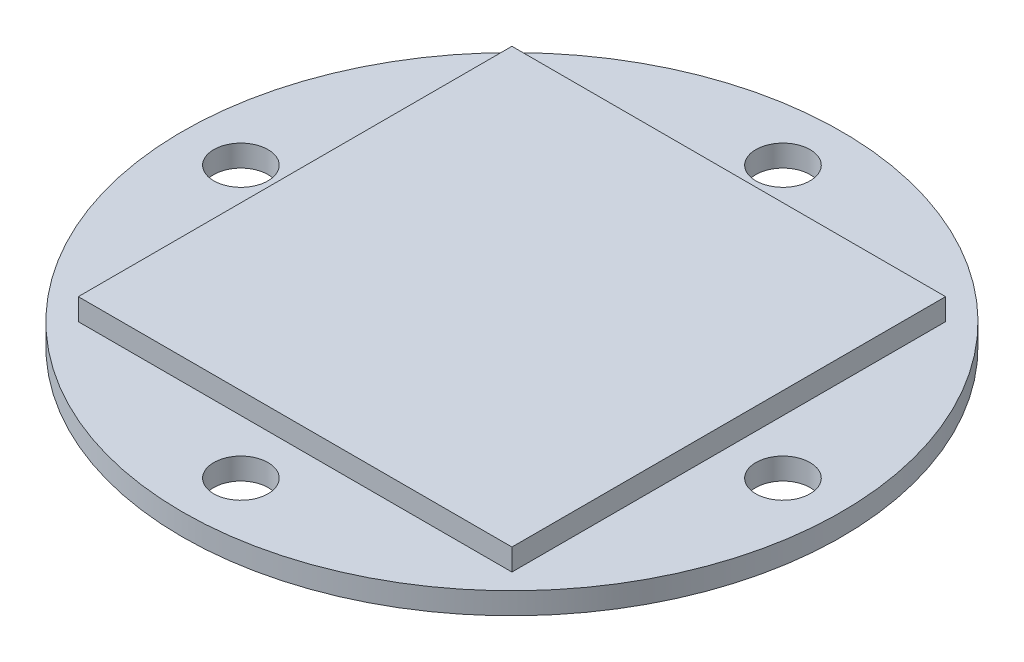
ISO-10303-21;
HEADER;
FILE_DESCRIPTION(('STEP AP214'),'2;1');
FILE_NAME('part.step','',(''),(''),'','','');
FILE_SCHEMA(('AUTOMOTIVE_DESIGN { 1 0 10303 214 1 1 1 1 }'));
ENDSEC;
DATA;
#1=APPLICATION_CONTEXT('core data for automotive mechanical design processes');
#2=APPLICATION_PROTOCOL_DEFINITION('international standard','automotive_design',2000,#1);
#3=PRODUCT_CONTEXT('',#1,'mechanical');
#4=PRODUCT('Part','Part','',(#3));
#5=PRODUCT_RELATED_PRODUCT_CATEGORY('part','',(#4));
#6=PRODUCT_DEFINITION_FORMATION('','',#4);
#7=PRODUCT_DEFINITION_CONTEXT('part definition',#1,'design');
#8=PRODUCT_DEFINITION('design','',#6,#7);
#9=PRODUCT_DEFINITION_SHAPE('','',#8);
#10=(LENGTH_UNIT() NAMED_UNIT(*) SI_UNIT(.MILLI.,.METRE.));
#11=(NAMED_UNIT(*) PLANE_ANGLE_UNIT() SI_UNIT($,.RADIAN.));
#12=(NAMED_UNIT(*) SI_UNIT($,.STERADIAN.) SOLID_ANGLE_UNIT());
#13=UNCERTAINTY_MEASURE_WITH_UNIT(LENGTH_MEASURE(1.E-05),#10,'distance_accuracy_value','');
#14=(GEOMETRIC_REPRESENTATION_CONTEXT(3) GLOBAL_UNCERTAINTY_ASSIGNED_CONTEXT((#13)) GLOBAL_UNIT_ASSIGNED_CONTEXT((#10,
#11,#12)) REPRESENTATION_CONTEXT('',''));
#15=CARTESIAN_POINT('',(0.,0.,0.));
#16=DIRECTION('',(0.,0.,1.));
#17=DIRECTION('',(1.,0.,0.));
#18=AXIS2_PLACEMENT_3D('',#15,#16,#17);
#19=CARTESIAN_POINT('',(0.,0.,0.));
#20=DIRECTION('',(0.,1.,0.));
#21=DIRECTION('',(0.,0.,1.));
#22=AXIS2_PLACEMENT_3D('',#19,#20,#21);
#23=PLANE('',#22);
#24=DIRECTION('',(1.,0.,0.));
#25=VECTOR('',#24,1.);
#26=CARTESIAN_POINT('',(0.,0.,20.));
#27=LINE('',#26,#25);
#28=CARTESIAN_POINT('',(7.5,0.,20.));
#29=VERTEX_POINT('',#28);
#30=CARTESIAN_POINT('',(22.5,0.,20.));
#31=VERTEX_POINT('',#30);
#32=EDGE_CURVE('E163',#29,#31,#27,.T.);
#33=ORIENTED_EDGE('',*,*,#32,.T.);
#34=DIRECTION('',(0.,0.,-1.));
#35=VECTOR('',#34,1.);
#36=CARTESIAN_POINT('',(22.5,0.,0.));
#37=LINE('',#36,#35);
#38=CARTESIAN_POINT('',(22.5,0.,-20.));
#39=VERTEX_POINT('',#38);
#40=EDGE_CURVE('E145',#31,#39,#37,.T.);
#41=ORIENTED_EDGE('',*,*,#40,.T.);
#42=DIRECTION('',(1.,0.,0.));
#43=VECTOR('',#42,1.);
#44=CARTESIAN_POINT('',(0.,0.,-20.));
#45=LINE('',#44,#43);
#46=CARTESIAN_POINT('',(7.5,0.,-20.));
#47=VERTEX_POINT('',#46);
#48=EDGE_CURVE('E154',#47,#39,#45,.T.);
#49=ORIENTED_EDGE('',*,*,#48,.F.);
#50=DIRECTION('',(0.,0.,1.));
#51=VECTOR('',#50,1.);
#52=CARTESIAN_POINT('',(7.5,0.,0.));
#53=LINE('',#52,#51);
#54=EDGE_CURVE('E170',#47,#29,#53,.T.);
#55=ORIENTED_EDGE('',*,*,#54,.T.);
#56=EDGE_LOOP('',(#33,#41,#49,#55));
#57=FACE_BOUND('',#56,.T.);
#58=CARTESIAN_POINT('',(0.,0.,0.));
#59=DIRECTION('',(0.,1.,0.));
#60=DIRECTION('',(0.,0.,1.));
#61=AXIS2_PLACEMENT_3D('',#58,#59,#60);
#62=CIRCLE('',#61,76.);
#63=CARTESIAN_POINT('',(0.,0.,76.));
#64=VERTEX_POINT('',#63);
#65=EDGE_CURVE('E260',#64,#64,#62,.T.);
#66=ORIENTED_EDGE('',*,*,#65,.F.);
#67=EDGE_LOOP('',(#66));
#68=FACE_BOUND('',#67,.T.);
#69=CARTESIAN_POINT('',(0.,0.,62.5));
#70=DIRECTION('',(0.,1.,0.));
#71=DIRECTION('',(0.,0.,1.));
#72=AXIS2_PLACEMENT_3D('',#69,#70,#71);
#73=CIRCLE('',#72,6.25);
#74=CARTESIAN_POINT('',(0.,0.,68.75));
#75=VERTEX_POINT('',#74);
#76=EDGE_CURVE('E281',#75,#75,#73,.T.);
#77=ORIENTED_EDGE('',*,*,#76,.T.);
#78=EDGE_LOOP('',(#77));
#79=FACE_BOUND('',#78,.T.);
#80=CARTESIAN_POINT('',(62.5,0.,0.));
#81=DIRECTION('',(0.,1.,0.));
#82=DIRECTION('',(0.,0.,1.));
#83=AXIS2_PLACEMENT_3D('',#80,#81,#82);
#84=CIRCLE('',#83,6.25);
#85=CARTESIAN_POINT('',(62.5,0.,6.25));
#86=VERTEX_POINT('',#85);
#87=EDGE_CURVE('E273',#86,#86,#84,.T.);
#88=ORIENTED_EDGE('',*,*,#87,.T.);
#89=EDGE_LOOP('',(#88));
#90=FACE_BOUND('',#89,.T.);
#91=CARTESIAN_POINT('',(0.,0.,-62.5));
#92=DIRECTION('',(0.,1.,0.));
#93=DIRECTION('',(0.,0.,1.));
#94=AXIS2_PLACEMENT_3D('',#91,#92,#93);
#95=CIRCLE('',#94,6.25);
#96=CARTESIAN_POINT('',(0.,0.,-56.25));
#97=VERTEX_POINT('',#96);
#98=EDGE_CURVE('E265',#97,#97,#95,.T.);
#99=ORIENTED_EDGE('',*,*,#98,.T.);
#100=EDGE_LOOP('',(#99));
#101=FACE_BOUND('',#100,.T.);
#102=CARTESIAN_POINT('',(-62.5,0.,0.));
#103=DIRECTION('',(0.,1.,0.));
#104=DIRECTION('',(0.,0.,1.));
#105=AXIS2_PLACEMENT_3D('',#102,#103,#104);
#106=CIRCLE('',#105,6.25);
#107=CARTESIAN_POINT('',(-62.5,0.,6.25));
#108=VERTEX_POINT('',#107);
#109=EDGE_CURVE('E261',#108,#108,#106,.T.);
#110=ORIENTED_EDGE('',*,*,#109,.T.);
#111=EDGE_LOOP('',(#110));
#112=FACE_BOUND('',#111,.T.);
#113=DIRECTION('',(-1.,0.,0.));
#114=VECTOR('',#113,1.);
#115=CARTESIAN_POINT('',(0.,0.,20.));
#116=LINE('',#115,#114);
#117=CARTESIAN_POINT('',(-7.5,0.,20.));
#118=VERTEX_POINT('',#117);
#119=CARTESIAN_POINT('',(-22.5,0.,20.));
#120=VERTEX_POINT('',#119);
#121=EDGE_CURVE('E184',#118,#120,#116,.T.);
#122=ORIENTED_EDGE('',*,*,#121,.F.);
#123=DIRECTION('',(0.,0.,1.));
#124=VECTOR('',#123,1.);
#125=CARTESIAN_POINT('',(-7.5,0.,0.));
#126=LINE('',#125,#124);
#127=CARTESIAN_POINT('',(-7.5,0.,-20.));
#128=VERTEX_POINT('',#127);
#129=EDGE_CURVE('E196',#128,#118,#126,.T.);
#130=ORIENTED_EDGE('',*,*,#129,.F.);
#131=DIRECTION('',(-1.,0.,0.));
#132=VECTOR('',#131,1.);
#133=CARTESIAN_POINT('',(0.,0.,-20.));
#134=LINE('',#133,#132);
#135=CARTESIAN_POINT('',(-22.5,0.,-20.));
#136=VERTEX_POINT('',#135);
#137=EDGE_CURVE('E192',#128,#136,#134,.T.);
#138=ORIENTED_EDGE('',*,*,#137,.T.);
#139=DIRECTION('',(0.,0.,-1.));
#140=VECTOR('',#139,1.);
#141=CARTESIAN_POINT('',(-22.5,0.,0.));
#142=LINE('',#141,#140);
#143=EDGE_CURVE('E188',#120,#136,#142,.T.);
#144=ORIENTED_EDGE('',*,*,#143,.F.);
#145=EDGE_LOOP('',(#122,#130,#138,#144));
#146=FACE_BOUND('',#145,.T.);
#147=ADVANCED_FACE('F41',(#57,#68,#79,#90,#101,#112,#146),#23,.F.);
#148=CARTESIAN_POINT('',(0.,5.,0.));
#149=DIRECTION('',(0.,1.,0.));
#150=DIRECTION('',(0.,0.,1.));
#151=AXIS2_PLACEMENT_3D('',#148,#149,#150);
#152=PLANE('',#151);
#153=CARTESIAN_POINT('',(-62.5,5.,0.));
#154=DIRECTION('',(0.,1.,0.));
#155=DIRECTION('',(0.,0.,1.));
#156=AXIS2_PLACEMENT_3D('',#153,#154,#155);
#157=CIRCLE('',#156,6.25);
#158=CARTESIAN_POINT('',(-62.5,5.,6.25));
#159=VERTEX_POINT('',#158);
#160=EDGE_CURVE('E256',#159,#159,#157,.T.);
#161=ORIENTED_EDGE('',*,*,#160,.F.);
#162=EDGE_LOOP('',(#161));
#163=FACE_BOUND('',#162,.T.);
#164=CARTESIAN_POINT('',(0.,5.,-62.5));
#165=DIRECTION('',(0.,1.,0.));
#166=DIRECTION('',(0.,0.,1.));
#167=AXIS2_PLACEMENT_3D('',#164,#165,#166);
#168=CIRCLE('',#167,6.25);
#169=CARTESIAN_POINT('',(0.,5.,-56.25));
#170=VERTEX_POINT('',#169);
#171=EDGE_CURVE('E269',#170,#170,#168,.T.);
#172=ORIENTED_EDGE('',*,*,#171,.F.);
#173=EDGE_LOOP('',(#172));
#174=FACE_BOUND('',#173,.T.);
#175=CARTESIAN_POINT('',(62.5,5.,0.));
#176=DIRECTION('',(0.,1.,0.));
#177=DIRECTION('',(0.,0.,1.));
#178=AXIS2_PLACEMENT_3D('',#175,#176,#177);
#179=CIRCLE('',#178,6.25);
#180=CARTESIAN_POINT('',(62.5,5.,6.25));
#181=VERTEX_POINT('',#180);
#182=EDGE_CURVE('E277',#181,#181,#179,.T.);
#183=ORIENTED_EDGE('',*,*,#182,.F.);
#184=EDGE_LOOP('',(#183));
#185=FACE_BOUND('',#184,.T.);
#186=CARTESIAN_POINT('',(0.,5.,62.5));
#187=DIRECTION('',(0.,1.,0.));
#188=DIRECTION('',(0.,0.,1.));
#189=AXIS2_PLACEMENT_3D('',#186,#187,#188);
#190=CIRCLE('',#189,6.25);
#191=CARTESIAN_POINT('',(0.,5.,68.75));
#192=VERTEX_POINT('',#191);
#193=EDGE_CURVE('E255',#192,#192,#190,.T.);
#194=ORIENTED_EDGE('',*,*,#193,.F.);
#195=EDGE_LOOP('',(#194));
#196=FACE_BOUND('',#195,.T.);
#197=CARTESIAN_POINT('',(0.,5.,0.));
#198=DIRECTION('',(0.,1.,0.));
#199=DIRECTION('',(0.,0.,1.));
#200=AXIS2_PLACEMENT_3D('',#197,#198,#199);
#201=CIRCLE('',#200,76.);
#202=CARTESIAN_POINT('',(0.,5.,76.));
#203=VERTEX_POINT('',#202);
#204=EDGE_CURVE('E288',#203,#203,#201,.T.);
#205=ORIENTED_EDGE('',*,*,#204,.T.);
#206=EDGE_LOOP('',(#205));
#207=FACE_BOUND('',#206,.T.);
#208=DIRECTION('',(0.,0.,1.));
#209=VECTOR('',#208,1.);
#210=CARTESIAN_POINT('',(50.,5.,-50.));
#211=LINE('',#210,#209);
#212=CARTESIAN_POINT('',(50.,5.,-50.));
#213=VERTEX_POINT('',#212);
#214=CARTESIAN_POINT('',(50.,5.,50.));
#215=VERTEX_POINT('',#214);
#216=EDGE_CURVE('E232',#213,#215,#211,.T.);
#217=ORIENTED_EDGE('',*,*,#216,.T.);
#218=DIRECTION('',(1.,0.,0.));
#219=VECTOR('',#218,1.);
#220=CARTESIAN_POINT('',(-50.,5.,50.));
#221=LINE('',#220,#219);
#222=CARTESIAN_POINT('',(-50.,5.,50.));
#223=VERTEX_POINT('',#222);
#224=EDGE_CURVE('E212',#223,#215,#221,.T.);
#225=ORIENTED_EDGE('',*,*,#224,.F.);
#226=DIRECTION('',(0.,0.,1.));
#227=VECTOR('',#226,1.);
#228=CARTESIAN_POINT('',(-50.,5.,-50.));
#229=LINE('',#228,#227);
#230=CARTESIAN_POINT('',(-50.,5.,-50.));
#231=VERTEX_POINT('',#230);
#232=EDGE_CURVE('E217',#231,#223,#229,.T.);
#233=ORIENTED_EDGE('',*,*,#232,.F.);
#234=DIRECTION('',(1.,0.,0.));
#235=VECTOR('',#234,1.);
#236=CARTESIAN_POINT('',(-50.,5.,-50.));
#237=LINE('',#236,#235);
#238=EDGE_CURVE('E236',#231,#213,#237,.T.);
#239=ORIENTED_EDGE('',*,*,#238,.T.);
#240=EDGE_LOOP('',(#217,#225,#233,#239));
#241=FACE_BOUND('',#240,.T.);
#242=ADVANCED_FACE('F383',(#163,#174,#185,#196,#207,#241),#152,.T.);
#243=CARTESIAN_POINT('',(0.,5.,0.));
#244=DIRECTION('',(0.,-1.,0.));
#245=DIRECTION('',(0.,0.,-1.));
#246=AXIS2_PLACEMENT_3D('',#243,#244,#245);
#247=CYLINDRICAL_SURFACE('',#246,76.);
#248=ORIENTED_EDGE('',*,*,#204,.F.);
#249=EDGE_LOOP('',(#248));
#250=FACE_BOUND('',#249,.T.);
#251=ORIENTED_EDGE('',*,*,#65,.T.);
#252=EDGE_LOOP('',(#251));
#253=FACE_BOUND('',#252,.T.);
#254=ADVANCED_FACE('F388',(#250,#253),#247,.T.);
#255=CARTESIAN_POINT('',(0.,5.,62.5));
#256=DIRECTION('',(0.,-1.,0.));
#257=DIRECTION('',(0.,0.,-1.));
#258=AXIS2_PLACEMENT_3D('',#255,#256,#257);
#259=CYLINDRICAL_SURFACE('',#258,6.25);
#260=ORIENTED_EDGE('',*,*,#193,.T.);
#261=EDGE_LOOP('',(#260));
#262=FACE_BOUND('',#261,.T.);
#263=ORIENTED_EDGE('',*,*,#76,.F.);
#264=EDGE_LOOP('',(#263));
#265=FACE_BOUND('',#264,.T.);
#266=ADVANCED_FACE('F393',(#262,#265),#259,.F.);
#267=CARTESIAN_POINT('',(62.5,5.,0.));
#268=DIRECTION('',(0.,-1.,0.));
#269=DIRECTION('',(0.,0.,-1.));
#270=AXIS2_PLACEMENT_3D('',#267,#268,#269);
#271=CYLINDRICAL_SURFACE('',#270,6.25);
#272=ORIENTED_EDGE('',*,*,#182,.T.);
#273=EDGE_LOOP('',(#272));
#274=FACE_BOUND('',#273,.T.);
#275=ORIENTED_EDGE('',*,*,#87,.F.);
#276=EDGE_LOOP('',(#275));
#277=FACE_BOUND('',#276,.T.);
#278=ADVANCED_FACE('F398',(#274,#277),#271,.F.);
#279=CARTESIAN_POINT('',(0.,5.,-62.5));
#280=DIRECTION('',(0.,-1.,0.));
#281=DIRECTION('',(0.,0.,-1.));
#282=AXIS2_PLACEMENT_3D('',#279,#280,#281);
#283=CYLINDRICAL_SURFACE('',#282,6.25);
#284=ORIENTED_EDGE('',*,*,#171,.T.);
#285=EDGE_LOOP('',(#284));
#286=FACE_BOUND('',#285,.T.);
#287=ORIENTED_EDGE('',*,*,#98,.F.);
#288=EDGE_LOOP('',(#287));
#289=FACE_BOUND('',#288,.T.);
#290=ADVANCED_FACE('F478',(#286,#289),#283,.F.);
#291=CARTESIAN_POINT('',(-62.5,5.,0.));
#292=DIRECTION('',(0.,-1.,0.));
#293=DIRECTION('',(0.,0.,-1.));
#294=AXIS2_PLACEMENT_3D('',#291,#292,#293);
#295=CYLINDRICAL_SURFACE('',#294,6.25);
#296=ORIENTED_EDGE('',*,*,#160,.T.);
#297=EDGE_LOOP('',(#296));
#298=FACE_BOUND('',#297,.T.);
#299=ORIENTED_EDGE('',*,*,#109,.F.);
#300=EDGE_LOOP('',(#299));
#301=FACE_BOUND('',#300,.T.);
#302=ADVANCED_FACE('F474',(#298,#301),#295,.F.);
#303=CARTESIAN_POINT('',(-50.,10.,50.));
#304=DIRECTION('',(0.,0.,-1.));
#305=DIRECTION('',(-1.,0.,0.));
#306=AXIS2_PLACEMENT_3D('',#303,#304,#305);
#307=PLANE('',#306);
#308=ORIENTED_EDGE('',*,*,#224,.T.);
#309=DIRECTION('',(0.,-1.,0.));
#310=VECTOR('',#309,1.);
#311=CARTESIAN_POINT('',(50.,10.,50.));
#312=LINE('',#311,#310);
#313=CARTESIAN_POINT('',(50.,10.,50.));
#314=VERTEX_POINT('',#313);
#315=EDGE_CURVE('E252',#314,#215,#312,.T.);
#316=ORIENTED_EDGE('',*,*,#315,.F.);
#317=DIRECTION('',(1.,0.,0.));
#318=VECTOR('',#317,1.);
#319=CARTESIAN_POINT('',(-50.,10.,50.));
#320=LINE('',#319,#318);
#321=CARTESIAN_POINT('',(-50.,10.,50.));
#322=VERTEX_POINT('',#321);
#323=EDGE_CURVE('E213',#322,#314,#320,.T.);
#324=ORIENTED_EDGE('',*,*,#323,.F.);
#325=DIRECTION('',(0.,-1.,0.));
#326=VECTOR('',#325,1.);
#327=CARTESIAN_POINT('',(-50.,10.,50.));
#328=LINE('',#327,#326);
#329=EDGE_CURVE('E228',#322,#223,#328,.T.);
#330=ORIENTED_EDGE('',*,*,#329,.T.);
#331=EDGE_LOOP('',(#308,#316,#324,#330));
#332=FACE_BOUND('',#331,.T.);
#333=ADVANCED_FACE('F470',(#332),#307,.F.);
#334=CARTESIAN_POINT('',(50.,10.,-50.));
#335=DIRECTION('',(1.,0.,0.));
#336=DIRECTION('',(0.,0.,-1.));
#337=AXIS2_PLACEMENT_3D('',#334,#335,#336);
#338=PLANE('',#337);
#339=ORIENTED_EDGE('',*,*,#216,.F.);
#340=DIRECTION('',(0.,-1.,0.));
#341=VECTOR('',#340,1.);
#342=CARTESIAN_POINT('',(50.,10.,-50.));
#343=LINE('',#342,#341);
#344=CARTESIAN_POINT('',(50.,10.,-50.));
#345=VERTEX_POINT('',#344);
#346=EDGE_CURVE('E249',#345,#213,#343,.T.);
#347=ORIENTED_EDGE('',*,*,#346,.F.);
#348=DIRECTION('',(0.,0.,1.));
#349=VECTOR('',#348,1.);
#350=CARTESIAN_POINT('',(50.,10.,-50.));
#351=LINE('',#350,#349);
#352=EDGE_CURVE('E216',#345,#314,#351,.T.);
#353=ORIENTED_EDGE('',*,*,#352,.T.);
#354=ORIENTED_EDGE('',*,*,#315,.T.);
#355=EDGE_LOOP('',(#339,#347,#353,#354));
#356=FACE_BOUND('',#355,.T.);
#357=ADVANCED_FACE('F466',(#356),#338,.T.);
#358=CARTESIAN_POINT('',(-50.,10.,-50.));
#359=DIRECTION('',(0.,0.,-1.));
#360=DIRECTION('',(-1.,0.,0.));
#361=AXIS2_PLACEMENT_3D('',#358,#359,#360);
#362=PLANE('',#361);
#363=ORIENTED_EDGE('',*,*,#238,.F.);
#364=DIRECTION('',(0.,-1.,0.));
#365=VECTOR('',#364,1.);
#366=CARTESIAN_POINT('',(-50.,10.,-50.));
#367=LINE('',#366,#365);
#368=CARTESIAN_POINT('',(-50.,10.,-50.));
#369=VERTEX_POINT('',#368);
#370=EDGE_CURVE('E245',#369,#231,#367,.T.);
#371=ORIENTED_EDGE('',*,*,#370,.F.);
#372=DIRECTION('',(1.,0.,0.));
#373=VECTOR('',#372,1.);
#374=CARTESIAN_POINT('',(-50.,10.,-50.));
#375=LINE('',#374,#373);
#376=EDGE_CURVE('E221',#369,#345,#375,.T.);
#377=ORIENTED_EDGE('',*,*,#376,.T.);
#378=ORIENTED_EDGE('',*,*,#346,.T.);
#379=EDGE_LOOP('',(#363,#371,#377,#378));
#380=FACE_BOUND('',#379,.T.);
#381=ADVANCED_FACE('F462',(#380),#362,.T.);
#382=CARTESIAN_POINT('',(-50.,10.,-50.));
#383=DIRECTION('',(1.,0.,0.));
#384=DIRECTION('',(0.,0.,-1.));
#385=AXIS2_PLACEMENT_3D('',#382,#383,#384);
#386=PLANE('',#385);
#387=ORIENTED_EDGE('',*,*,#232,.T.);
#388=ORIENTED_EDGE('',*,*,#329,.F.);
#389=DIRECTION('',(0.,0.,1.));
#390=VECTOR('',#389,1.);
#391=CARTESIAN_POINT('',(-50.,10.,-50.));
#392=LINE('',#391,#390);
#393=EDGE_CURVE('E225',#369,#322,#392,.T.);
#394=ORIENTED_EDGE('',*,*,#393,.F.);
#395=ORIENTED_EDGE('',*,*,#370,.T.);
#396=EDGE_LOOP('',(#387,#388,#394,#395));
#397=FACE_BOUND('',#396,.T.);
#398=ADVANCED_FACE('F458',(#397),#386,.F.);
#399=CARTESIAN_POINT('',(0.,10.,0.));
#400=DIRECTION('',(0.,-1.,0.));
#401=DIRECTION('',(0.,0.,-1.));
#402=AXIS2_PLACEMENT_3D('',#399,#400,#401);
#403=PLANE('',#402);
#404=ORIENTED_EDGE('',*,*,#323,.T.);
#405=ORIENTED_EDGE('',*,*,#352,.F.);
#406=ORIENTED_EDGE('',*,*,#376,.F.);
#407=ORIENTED_EDGE('',*,*,#393,.T.);
#408=EDGE_LOOP('',(#404,#405,#406,#407));
#409=FACE_BOUND('',#408,.T.);
#410=ADVANCED_FACE('F455',(#409),#403,.F.);
#411=CARTESIAN_POINT('',(0.,-35.,20.));
#412=DIRECTION('',(0.,0.,-1.));
#413=DIRECTION('',(-1.,0.,0.));
#414=AXIS2_PLACEMENT_3D('',#411,#412,#413);
#415=PLANE('',#414);
#416=DIRECTION('',(0.,1.,0.));
#417=VECTOR('',#416,1.);
#418=CARTESIAN_POINT('',(-22.5,-35.,20.));
#419=LINE('',#418,#417);
#420=CARTESIAN_POINT('',(-22.5,-15.,20.));
#421=VERTEX_POINT('',#420);
#422=EDGE_CURVE('E209',#421,#120,#419,.T.);
#423=ORIENTED_EDGE('',*,*,#422,.F.);
#424=DIRECTION('',(-1.,0.,0.));
#425=VECTOR('',#424,1.);
#426=CARTESIAN_POINT('',(-7.5,-15.,20.));
#427=LINE('',#426,#425);
#428=CARTESIAN_POINT('',(-7.5,-15.,20.));
#429=VERTEX_POINT('',#428);
#430=EDGE_CURVE('E318',#421,#429,#427,.F.);
#431=ORIENTED_EDGE('',*,*,#430,.T.);
#432=DIRECTION('',(0.,1.,0.));
#433=VECTOR('',#432,1.);
#434=CARTESIAN_POINT('',(-7.5,-35.,20.));
#435=LINE('',#434,#433);
#436=EDGE_CURVE('E200',#429,#118,#435,.T.);
#437=ORIENTED_EDGE('',*,*,#436,.T.);
#438=ORIENTED_EDGE('',*,*,#121,.T.);
#439=EDGE_LOOP('',(#423,#431,#437,#438));
#440=FACE_BOUND('',#439,.T.);
#441=ADVANCED_FACE('F427',(#440),#415,.F.);
#442=CARTESIAN_POINT('',(-22.5,-35.,0.));
#443=DIRECTION('',(1.,0.,0.));
#444=DIRECTION('',(0.,0.,-1.));
#445=AXIS2_PLACEMENT_3D('',#442,#443,#444);
#446=PLANE('',#445);
#447=CARTESIAN_POINT('',(-22.5,-15.,0.));
#448=DIRECTION('',(1.,0.,0.));
#449=DIRECTION('',(0.,0.,-1.));
#450=AXIS2_PLACEMENT_3D('',#447,#448,#449);
#451=CIRCLE('',#450,10.);
#452=CARTESIAN_POINT('',(-22.5,-15.,-10.));
#453=VERTEX_POINT('',#452);
#454=EDGE_CURVE('E331',#453,#453,#451,.T.);
#455=ORIENTED_EDGE('',*,*,#454,.T.);
#456=EDGE_LOOP('',(#455));
#457=FACE_BOUND('',#456,.T.);
#458=CARTESIAN_POINT('',(-22.5,-15.,0.));
#459=DIRECTION('',(1.,0.,0.));
#460=DIRECTION('',(0.,0.,-1.));
#461=AXIS2_PLACEMENT_3D('',#458,#459,#460);
#462=CIRCLE('',#461,20.);
#463=CARTESIAN_POINT('',(-22.5,-15.,-20.));
#464=VERTEX_POINT('',#463);
#465=CARTESIAN_POINT('',(-22.5,-35.,0.));
#466=VERTEX_POINT('',#465);
#467=EDGE_CURVE('E312',#464,#466,#462,.F.);
#468=ORIENTED_EDGE('',*,*,#467,.T.);
#469=CARTESIAN_POINT('',(-22.5,-15.,0.));
#470=DIRECTION('',(1.,0.,0.));
#471=DIRECTION('',(0.,0.,-1.));
#472=AXIS2_PLACEMENT_3D('',#469,#470,#471);
#473=CIRCLE('',#472,20.);
#474=EDGE_CURVE('E315',#466,#421,#473,.F.);
#475=ORIENTED_EDGE('',*,*,#474,.T.);
#476=ORIENTED_EDGE('',*,*,#422,.T.);
#477=ORIENTED_EDGE('',*,*,#143,.T.);
#478=DIRECTION('',(0.,1.,0.));
#479=VECTOR('',#478,1.);
#480=CARTESIAN_POINT('',(-22.5,-35.,-20.));
#481=LINE('',#480,#479);
#482=EDGE_CURVE('E206',#464,#136,#481,.T.);
#483=ORIENTED_EDGE('',*,*,#482,.F.);
#484=EDGE_LOOP('',(#468,#475,#476,#477,#483));
#485=FACE_BOUND('',#484,.T.);
#486=ADVANCED_FACE('F425',(#457,#485),#446,.F.);
#487=CARTESIAN_POINT('',(0.,-35.,-20.));
#488=DIRECTION('',(0.,0.,-1.));
#489=DIRECTION('',(-1.,0.,0.));
#490=AXIS2_PLACEMENT_3D('',#487,#488,#489);
#491=PLANE('',#490);
#492=DIRECTION('',(0.,1.,0.));
#493=VECTOR('',#492,1.);
#494=CARTESIAN_POINT('',(-7.5,-35.,-20.));
#495=LINE('',#494,#493);
#496=CARTESIAN_POINT('',(-7.5,-15.,-20.));
#497=VERTEX_POINT('',#496);
#498=EDGE_CURVE('E203',#497,#128,#495,.T.);
#499=ORIENTED_EDGE('',*,*,#498,.F.);
#500=DIRECTION('',(-1.,0.,0.));
#501=VECTOR('',#500,1.);
#502=CARTESIAN_POINT('',(0.,-15.,-20.));
#503=LINE('',#502,#501);
#504=EDGE_CURVE('E11',#497,#464,#503,.T.);
#505=ORIENTED_EDGE('',*,*,#504,.T.);
#506=ORIENTED_EDGE('',*,*,#482,.T.);
#507=ORIENTED_EDGE('',*,*,#137,.F.);
#508=EDGE_LOOP('',(#499,#505,#506,#507));
#509=FACE_BOUND('',#508,.T.);
#510=ADVANCED_FACE('F421',(#509),#491,.T.);
#511=CARTESIAN_POINT('',(-7.5,-35.,0.));
#512=DIRECTION('',(-1.,0.,0.));
#513=DIRECTION('',(0.,0.,1.));
#514=AXIS2_PLACEMENT_3D('',#511,#512,#513);
#515=PLANE('',#514);
#516=CARTESIAN_POINT('',(-7.5,-15.,0.));
#517=DIRECTION('',(-1.,0.,0.));
#518=DIRECTION('',(0.,0.,1.));
#519=AXIS2_PLACEMENT_3D('',#516,#517,#518);
#520=CIRCLE('',#519,10.);
#521=CARTESIAN_POINT('',(-7.5,-15.,10.));
#522=VERTEX_POINT('',#521);
#523=EDGE_CURVE('E337',#522,#522,#520,.T.);
#524=ORIENTED_EDGE('',*,*,#523,.T.);
#525=EDGE_LOOP('',(#524));
#526=FACE_BOUND('',#525,.T.);
#527=ORIENTED_EDGE('',*,*,#436,.F.);
#528=CARTESIAN_POINT('',(-7.5,-15.,0.));
#529=DIRECTION('',(-1.,0.,0.));
#530=DIRECTION('',(0.,0.,1.));
#531=AXIS2_PLACEMENT_3D('',#528,#529,#530);
#532=CIRCLE('',#531,20.);
#533=CARTESIAN_POINT('',(-7.5,-35.,0.));
#534=VERTEX_POINT('',#533);
#535=EDGE_CURVE('E51',#429,#534,#532,.F.);
#536=ORIENTED_EDGE('',*,*,#535,.T.);
#537=CARTESIAN_POINT('',(-7.5,-15.,0.));
#538=DIRECTION('',(-1.,0.,0.));
#539=DIRECTION('',(0.,0.,1.));
#540=AXIS2_PLACEMENT_3D('',#537,#538,#539);
#541=CIRCLE('',#540,20.);
#542=EDGE_CURVE('E59',#534,#497,#541,.F.);
#543=ORIENTED_EDGE('',*,*,#542,.T.);
#544=ORIENTED_EDGE('',*,*,#498,.T.);
#545=ORIENTED_EDGE('',*,*,#129,.T.);
#546=EDGE_LOOP('',(#527,#536,#543,#544,#545));
#547=FACE_BOUND('',#546,.T.);
#548=ADVANCED_FACE('F418',(#526,#547),#515,.F.);
#549=CARTESIAN_POINT('',(22.5,-35.,0.));
#550=DIRECTION('',(1.,0.,0.));
#551=DIRECTION('',(0.,0.,-1.));
#552=AXIS2_PLACEMENT_3D('',#549,#550,#551);
#553=PLANE('',#552);
#554=CARTESIAN_POINT('',(22.5,-15.,0.));
#555=DIRECTION('',(1.,0.,0.));
#556=DIRECTION('',(0.,0.,-1.));
#557=AXIS2_PLACEMENT_3D('',#554,#555,#556);
#558=CIRCLE('',#557,10.);
#559=CARTESIAN_POINT('',(22.5,-15.,-10.));
#560=VERTEX_POINT('',#559);
#561=EDGE_CURVE('E346',#560,#560,#558,.T.);
#562=ORIENTED_EDGE('',*,*,#561,.F.);
#563=EDGE_LOOP('',(#562));
#564=FACE_BOUND('',#563,.T.);
#565=CARTESIAN_POINT('',(22.5,-15.,0.));
#566=DIRECTION('',(1.,0.,0.));
#567=DIRECTION('',(0.,0.,-1.));
#568=AXIS2_PLACEMENT_3D('',#565,#566,#567);
#569=CIRCLE('',#568,20.);
#570=CARTESIAN_POINT('',(22.5,-15.,20.));
#571=VERTEX_POINT('',#570);
#572=CARTESIAN_POINT('',(22.5,-35.,0.));
#573=VERTEX_POINT('',#572);
#574=EDGE_CURVE('E292',#571,#573,#569,.T.);
#575=ORIENTED_EDGE('',*,*,#574,.T.);
#576=CARTESIAN_POINT('',(22.5,-15.,0.));
#577=DIRECTION('',(1.,0.,0.));
#578=DIRECTION('',(0.,0.,-1.));
#579=AXIS2_PLACEMENT_3D('',#576,#577,#578);
#580=CIRCLE('',#579,20.);
#581=CARTESIAN_POINT('',(22.5,-15.,-20.));
#582=VERTEX_POINT('',#581);
#583=EDGE_CURVE('E147',#573,#582,#580,.T.);
#584=ORIENTED_EDGE('',*,*,#583,.T.);
#585=DIRECTION('',(0.,1.,0.));
#586=VECTOR('',#585,1.);
#587=CARTESIAN_POINT('',(22.5,-35.,-20.));
#588=LINE('',#587,#586);
#589=EDGE_CURVE('E141',#582,#39,#588,.T.);
#590=ORIENTED_EDGE('',*,*,#589,.T.);
#591=ORIENTED_EDGE('',*,*,#40,.F.);
#592=DIRECTION('',(0.,1.,0.));
#593=VECTOR('',#592,1.);
#594=CARTESIAN_POINT('',(22.5,-35.,20.));
#595=LINE('',#594,#593);
#596=EDGE_CURVE('E181',#571,#31,#595,.T.);
#597=ORIENTED_EDGE('',*,*,#596,.F.);
#598=EDGE_LOOP('',(#575,#584,#590,#591,#597));
#599=FACE_BOUND('',#598,.T.);
#600=ADVANCED_FACE('F143',(#564,#599),#553,.T.);
#601=CARTESIAN_POINT('',(0.,-35.,20.));
#602=DIRECTION('',(0.,0.,1.));
#603=DIRECTION('',(1.,0.,0.));
#604=AXIS2_PLACEMENT_3D('',#601,#602,#603);
#605=PLANE('',#604);
#606=DIRECTION('',(0.,1.,0.));
#607=VECTOR('',#606,1.);
#608=CARTESIAN_POINT('',(7.5,-35.,20.));
#609=LINE('',#608,#607);
#610=CARTESIAN_POINT('',(7.5,-15.,20.));
#611=VERTEX_POINT('',#610);
#612=EDGE_CURVE('E178',#611,#29,#609,.T.);
#613=ORIENTED_EDGE('',*,*,#612,.F.);
#614=DIRECTION('',(1.,0.,0.));
#615=VECTOR('',#614,1.);
#616=CARTESIAN_POINT('',(0.,-15.,20.));
#617=LINE('',#616,#615);
#618=EDGE_CURVE('E309',#611,#571,#617,.T.);
#619=ORIENTED_EDGE('',*,*,#618,.T.);
#620=ORIENTED_EDGE('',*,*,#596,.T.);
#621=ORIENTED_EDGE('',*,*,#32,.F.);
#622=EDGE_LOOP('',(#613,#619,#620,#621));
#623=FACE_BOUND('',#622,.T.);
#624=ADVANCED_FACE('F360',(#623),#605,.T.);
#625=CARTESIAN_POINT('',(7.5,-35.,0.));
#626=DIRECTION('',(-1.,0.,0.));
#627=DIRECTION('',(0.,0.,1.));
#628=AXIS2_PLACEMENT_3D('',#625,#626,#627);
#629=PLANE('',#628);
#630=CARTESIAN_POINT('',(7.5,-15.,0.));
#631=DIRECTION('',(-1.,0.,0.));
#632=DIRECTION('',(0.,0.,1.));
#633=AXIS2_PLACEMENT_3D('',#630,#631,#632);
#634=CIRCLE('',#633,10.);
#635=CARTESIAN_POINT('',(7.5,-15.,10.));
#636=VERTEX_POINT('',#635);
#637=EDGE_CURVE('E45',#636,#636,#634,.T.);
#638=ORIENTED_EDGE('',*,*,#637,.F.);
#639=EDGE_LOOP('',(#638));
#640=FACE_BOUND('',#639,.T.);
#641=DIRECTION('',(0.,1.,0.));
#642=VECTOR('',#641,1.);
#643=CARTESIAN_POINT('',(7.5,-35.,-20.));
#644=LINE('',#643,#642);
#645=CARTESIAN_POINT('',(7.5,-15.,-20.));
#646=VERTEX_POINT('',#645);
#647=EDGE_CURVE('E153',#646,#47,#644,.T.);
#648=ORIENTED_EDGE('',*,*,#647,.F.);
#649=CARTESIAN_POINT('',(7.5,-15.,0.));
#650=DIRECTION('',(-1.,0.,0.));
#651=DIRECTION('',(0.,0.,1.));
#652=AXIS2_PLACEMENT_3D('',#649,#650,#651);
#653=CIRCLE('',#652,20.);
#654=CARTESIAN_POINT('',(7.5,-35.,0.));
#655=VERTEX_POINT('',#654);
#656=EDGE_CURVE('E306',#646,#655,#653,.T.);
#657=ORIENTED_EDGE('',*,*,#656,.T.);
#658=CARTESIAN_POINT('',(7.5,-15.,0.));
#659=DIRECTION('',(-1.,0.,0.));
#660=DIRECTION('',(0.,0.,1.));
#661=AXIS2_PLACEMENT_3D('',#658,#659,#660);
#662=CIRCLE('',#661,20.);
#663=EDGE_CURVE('E303',#655,#611,#662,.T.);
#664=ORIENTED_EDGE('',*,*,#663,.T.);
#665=ORIENTED_EDGE('',*,*,#612,.T.);
#666=ORIENTED_EDGE('',*,*,#54,.F.);
#667=EDGE_LOOP('',(#648,#657,#664,#665,#666));
#668=FACE_BOUND('',#667,.T.);
#669=ADVANCED_FACE('F357',(#640,#668),#629,.T.);
#670=CARTESIAN_POINT('',(0.,-35.,-20.));
#671=DIRECTION('',(0.,0.,1.));
#672=DIRECTION('',(1.,0.,0.));
#673=AXIS2_PLACEMENT_3D('',#670,#671,#672);
#674=PLANE('',#673);
#675=ORIENTED_EDGE('',*,*,#589,.F.);
#676=DIRECTION('',(1.,0.,0.));
#677=VECTOR('',#676,1.);
#678=CARTESIAN_POINT('',(7.5,-15.,-20.));
#679=LINE('',#678,#677);
#680=EDGE_CURVE('E300',#582,#646,#679,.F.);
#681=ORIENTED_EDGE('',*,*,#680,.T.);
#682=ORIENTED_EDGE('',*,*,#647,.T.);
#683=ORIENTED_EDGE('',*,*,#48,.T.);
#684=EDGE_LOOP('',(#675,#681,#682,#683));
#685=FACE_BOUND('',#684,.T.);
#686=ADVANCED_FACE('F167',(#685),#674,.F.);
#687=CARTESIAN_POINT('',(0.,-15.,0.));
#688=DIRECTION('',(1.,0.,0.));
#689=DIRECTION('',(0.,0.,-1.));
#690=AXIS2_PLACEMENT_3D('',#687,#688,#689);
#691=CYLINDRICAL_SURFACE('',#690,20.);
#692=ORIENTED_EDGE('',*,*,#618,.F.);
#693=ORIENTED_EDGE('',*,*,#663,.F.);
#694=DIRECTION('',(1.,0.,0.));
#695=VECTOR('',#694,1.);
#696=CARTESIAN_POINT('',(0.,-35.,0.));
#697=LINE('',#696,#695);
#698=EDGE_CURVE('E165',#573,#655,#697,.F.);
#699=ORIENTED_EDGE('',*,*,#698,.F.);
#700=ORIENTED_EDGE('',*,*,#574,.F.);
#701=EDGE_LOOP('',(#692,#693,#699,#700));
#702=FACE_BOUND('',#701,.T.);
#703=ADVANCED_FACE('F369',(#702),#691,.T.);
#704=CARTESIAN_POINT('',(0.,-15.,0.));
#705=DIRECTION('',(-1.,0.,0.));
#706=DIRECTION('',(0.,0.,1.));
#707=AXIS2_PLACEMENT_3D('',#704,#705,#706);
#708=CYLINDRICAL_SURFACE('',#707,20.);
#709=ORIENTED_EDGE('',*,*,#656,.F.);
#710=ORIENTED_EDGE('',*,*,#680,.F.);
#711=ORIENTED_EDGE('',*,*,#583,.F.);
#712=ORIENTED_EDGE('',*,*,#698,.T.);
#713=EDGE_LOOP('',(#709,#710,#711,#712));
#714=FACE_BOUND('',#713,.T.);
#715=ADVANCED_FACE('F371',(#714),#708,.T.);
#716=CARTESIAN_POINT('',(0.,-15.,0.));
#717=DIRECTION('',(-1.,0.,0.));
#718=DIRECTION('',(0.,0.,1.));
#719=AXIS2_PLACEMENT_3D('',#716,#717,#718);
#720=CYLINDRICAL_SURFACE('',#719,20.);
#721=ORIENTED_EDGE('',*,*,#504,.F.);
#722=ORIENTED_EDGE('',*,*,#542,.F.);
#723=DIRECTION('',(-1.,0.,0.));
#724=VECTOR('',#723,1.);
#725=CARTESIAN_POINT('',(0.,-35.,0.));
#726=LINE('',#725,#724);
#727=EDGE_CURVE('E328',#466,#534,#726,.F.);
#728=ORIENTED_EDGE('',*,*,#727,.F.);
#729=ORIENTED_EDGE('',*,*,#467,.F.);
#730=EDGE_LOOP('',(#721,#722,#728,#729));
#731=FACE_BOUND('',#730,.T.);
#732=ADVANCED_FACE('F43',(#731),#720,.T.);
#733=CARTESIAN_POINT('',(0.,-15.,0.));
#734=DIRECTION('',(1.,0.,0.));
#735=DIRECTION('',(0.,0.,-1.));
#736=AXIS2_PLACEMENT_3D('',#733,#734,#735);
#737=CYLINDRICAL_SURFACE('',#736,20.);
#738=ORIENTED_EDGE('',*,*,#535,.F.);
#739=ORIENTED_EDGE('',*,*,#430,.F.);
#740=ORIENTED_EDGE('',*,*,#474,.F.);
#741=ORIENTED_EDGE('',*,*,#727,.T.);
#742=EDGE_LOOP('',(#738,#739,#740,#741));
#743=FACE_BOUND('',#742,.T.);
#744=ADVANCED_FACE('F378',(#743),#737,.T.);
#745=CARTESIAN_POINT('',(-49.5,-15.,0.));
#746=DIRECTION('',(1.,0.,0.));
#747=DIRECTION('',(0.,0.,-1.));
#748=AXIS2_PLACEMENT_3D('',#745,#746,#747);
#749=CYLINDRICAL_SURFACE('',#748,10.);
#750=ORIENTED_EDGE('',*,*,#637,.T.);
#751=EDGE_LOOP('',(#750));
#752=FACE_BOUND('',#751,.T.);
#753=ORIENTED_EDGE('',*,*,#561,.T.);
#754=EDGE_LOOP('',(#753));
#755=FACE_BOUND('',#754,.T.);
#756=ADVANCED_FACE('F355',(#752,#755),#749,.F.);
#757=ORIENTED_EDGE('',*,*,#523,.F.);
#758=EDGE_LOOP('',(#757));
#759=FACE_BOUND('',#758,.T.);
#760=ORIENTED_EDGE('',*,*,#454,.F.);
#761=EDGE_LOOP('',(#760));
#762=FACE_BOUND('',#761,.T.);
#763=ADVANCED_FACE('F432',(#759,#762),#749,.F.);
#764=CLOSED_SHELL('',(#147,#242,#254,#266,#278,#290,#302,#333,#357,#381,#398,#410,#441,#486,
#510,#548,#600,#624,#669,#686,#703,#715,#732,#744,#756,#763));
#765=MANIFOLD_SOLID_BREP('B2',#764);
#766=ADVANCED_BREP_SHAPE_REPRESENTATION('',(#18,#765),#14);
#767=SHAPE_DEFINITION_REPRESENTATION(#9,#766);
ENDSEC;
END-ISO-10303-21;
